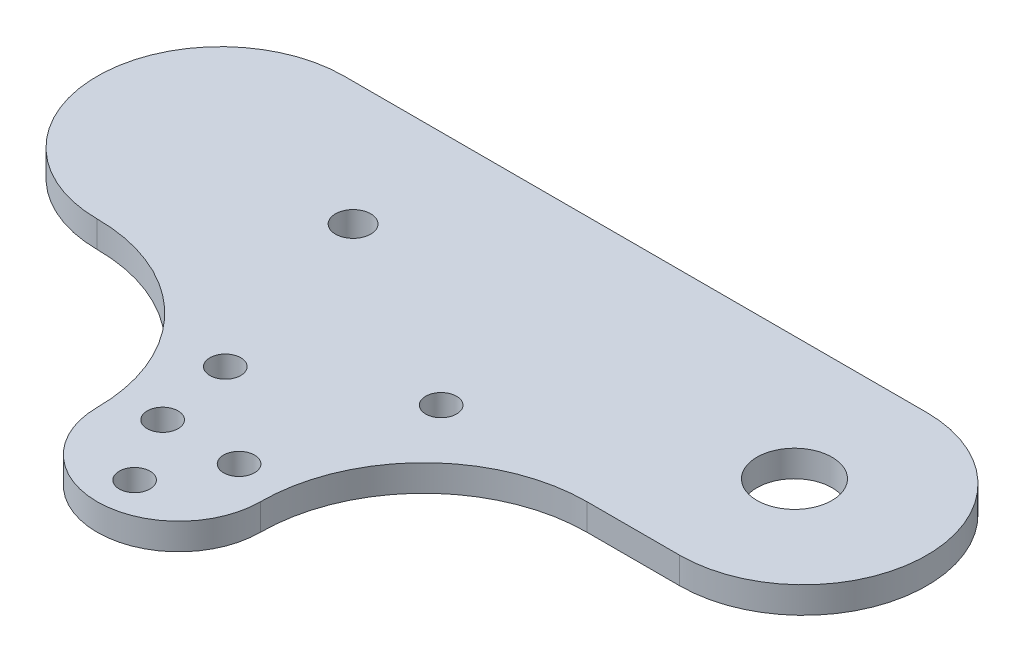
ISO-10303-21;
HEADER;
FILE_DESCRIPTION(('STEP AP214'),'2;1');
FILE_NAME('part.step','',(''),(''),'','','');
FILE_SCHEMA(('AUTOMOTIVE_DESIGN { 1 0 10303 214 1 1 1 1 }'));
ENDSEC;
DATA;
#1=APPLICATION_CONTEXT('core data for automotive mechanical design processes');
#2=APPLICATION_PROTOCOL_DEFINITION('international standard','automotive_design',2000,#1);
#3=PRODUCT_CONTEXT('',#1,'mechanical');
#4=PRODUCT('Part','Part','',(#3));
#5=PRODUCT_RELATED_PRODUCT_CATEGORY('part','',(#4));
#6=PRODUCT_DEFINITION_FORMATION('','',#4);
#7=PRODUCT_DEFINITION_CONTEXT('part definition',#1,'design');
#8=PRODUCT_DEFINITION('design','',#6,#7);
#9=PRODUCT_DEFINITION_SHAPE('','',#8);
#10=(LENGTH_UNIT() NAMED_UNIT(*) SI_UNIT(.MILLI.,.METRE.));
#11=(NAMED_UNIT(*) PLANE_ANGLE_UNIT() SI_UNIT($,.RADIAN.));
#12=(NAMED_UNIT(*) SI_UNIT($,.STERADIAN.) SOLID_ANGLE_UNIT());
#13=UNCERTAINTY_MEASURE_WITH_UNIT(LENGTH_MEASURE(1.E-05),#10,'distance_accuracy_value','');
#14=(GEOMETRIC_REPRESENTATION_CONTEXT(3) GLOBAL_UNCERTAINTY_ASSIGNED_CONTEXT((#13)) GLOBAL_UNIT_ASSIGNED_CONTEXT((#10,
#11,#12)) REPRESENTATION_CONTEXT('',''));
#15=CARTESIAN_POINT('',(0.,0.,0.));
#16=DIRECTION('',(0.,0.,1.));
#17=DIRECTION('',(1.,0.,0.));
#18=AXIS2_PLACEMENT_3D('',#15,#16,#17);
#19=CARTESIAN_POINT('',(26.,3.,0.));
#20=DIRECTION('',(0.,-1.,0.));
#21=DIRECTION('',(0.,0.,-1.));
#22=AXIS2_PLACEMENT_3D('',#19,#20,#21);
#23=CYLINDRICAL_SURFACE('',#22,14.);
#24=DIRECTION('',(0.,-1.,0.));
#25=VECTOR('',#24,1.);
#26=CARTESIAN_POINT('',(26.,3.,-14.));
#27=LINE('',#26,#25);
#28=CARTESIAN_POINT('',(26.,3.,-14.));
#29=VERTEX_POINT('',#28);
#30=CARTESIAN_POINT('',(26.,0.,-14.));
#31=VERTEX_POINT('',#30);
#32=EDGE_CURVE('E151',#29,#31,#27,.T.);
#33=ORIENTED_EDGE('',*,*,#32,.F.);
#34=CARTESIAN_POINT('',(26.,3.,0.));
#35=DIRECTION('',(0.,1.,0.));
#36=DIRECTION('',(0.,0.,1.));
#37=AXIS2_PLACEMENT_3D('',#34,#35,#36);
#38=CIRCLE('',#37,14.);
#39=CARTESIAN_POINT('',(26.,3.,14.));
#40=VERTEX_POINT('',#39);
#41=EDGE_CURVE('E157',#40,#29,#38,.T.);
#42=ORIENTED_EDGE('',*,*,#41,.F.);
#43=DIRECTION('',(0.,-1.,0.));
#44=VECTOR('',#43,1.);
#45=CARTESIAN_POINT('',(26.,3.,14.));
#46=LINE('',#45,#44);
#47=CARTESIAN_POINT('',(26.,0.,14.));
#48=VERTEX_POINT('',#47);
#49=EDGE_CURVE('E154',#48,#40,#46,.F.);
#50=ORIENTED_EDGE('',*,*,#49,.F.);
#51=CARTESIAN_POINT('',(26.,0.,0.));
#52=DIRECTION('',(0.,1.,0.));
#53=DIRECTION('',(0.,0.,1.));
#54=AXIS2_PLACEMENT_3D('',#51,#52,#53);
#55=CIRCLE('',#54,14.);
#56=EDGE_CURVE('E159',#31,#48,#55,.F.);
#57=ORIENTED_EDGE('',*,*,#56,.F.);
#58=EDGE_LOOP('',(#33,#42,#50,#57));
#59=FACE_BOUND('',#58,.T.);
#60=ADVANCED_FACE('F33',(#59),#23,.T.);
#61=CARTESIAN_POINT('',(0.,3.,0.));
#62=DIRECTION('',(0.,1.,0.));
#63=DIRECTION('',(0.,0.,1.));
#64=AXIS2_PLACEMENT_3D('',#61,#62,#63);
#65=PLANE('',#64);
#66=CARTESIAN_POINT('',(-2.24035053756942,3.,12.7860314998515));
#67=DIRECTION('',(0.,1.,0.));
#68=DIRECTION('',(0.,0.,1.));
#69=AXIS2_PLACEMENT_3D('',#66,#67,#68);
#70=CIRCLE('',#69,1.75);
#71=CARTESIAN_POINT('',(-2.24035053756942,3.,11.0360314998515));
#72=VERTEX_POINT('',#71);
#73=EDGE_CURVE('E334',#72,#72,#70,.F.);
#74=ORIENTED_EDGE('',*,*,#73,.T.);
#75=EDGE_LOOP('',(#74));
#76=FACE_BOUND('',#75,.T.);
#77=CARTESIAN_POINT('',(-16.5801270189222,3.,30.));
#78=DIRECTION('',(0.,1.,0.));
#79=DIRECTION('',(0.,0.,1.));
#80=AXIS2_PLACEMENT_3D('',#77,#78,#79);
#81=CIRCLE('',#80,1.75);
#82=CARTESIAN_POINT('',(-16.5801270189222,3.,28.25));
#83=VERTEX_POINT('',#82);
#84=EDGE_CURVE('E338',#83,#83,#81,.F.);
#85=ORIENTED_EDGE('',*,*,#84,.T.);
#86=EDGE_LOOP('',(#85));
#87=FACE_BOUND('',#86,.T.);
#88=CARTESIAN_POINT('',(-7.91987298107778,3.,30.));
#89=DIRECTION('',(0.,1.,0.));
#90=DIRECTION('',(0.,0.,1.));
#91=AXIS2_PLACEMENT_3D('',#88,#89,#90);
#92=CIRCLE('',#91,1.75000000000001);
#93=CARTESIAN_POINT('',(-7.91987298107778,3.,28.25));
#94=VERTEX_POINT('',#93);
#95=EDGE_CURVE('E346',#94,#94,#92,.F.);
#96=ORIENTED_EDGE('',*,*,#95,.T.);
#97=EDGE_LOOP('',(#96));
#98=FACE_BOUND('',#97,.T.);
#99=CARTESIAN_POINT('',(-18.2440780934357,3.,21.2336846309239));
#100=DIRECTION('',(0.,1.,0.));
#101=DIRECTION('',(0.,0.,1.));
#102=AXIS2_PLACEMENT_3D('',#99,#100,#101);
#103=CIRCLE('',#102,1.75);
#104=CARTESIAN_POINT('',(-18.2440780934357,3.,19.4836846309239));
#105=VERTEX_POINT('',#104);
#106=EDGE_CURVE('E351',#105,#105,#103,.F.);
#107=ORIENTED_EDGE('',*,*,#106,.T.);
#108=EDGE_LOOP('',(#107));
#109=FACE_BOUND('',#108,.T.);
#110=CARTESIAN_POINT('',(-12.25,3.,37.5));
#111=DIRECTION('',(0.,1.,0.));
#112=DIRECTION('',(0.,0.,1.));
#113=AXIS2_PLACEMENT_3D('',#110,#111,#112);
#114=CIRCLE('',#113,1.75);
#115=CARTESIAN_POINT('',(-12.25,3.,35.75));
#116=VERTEX_POINT('',#115);
#117=EDGE_CURVE('E118',#116,#116,#114,.F.);
#118=ORIENTED_EDGE('',*,*,#117,.T.);
#119=EDGE_LOOP('',(#118));
#120=FACE_BOUND('',#119,.T.);
#121=CARTESIAN_POINT('',(25.,3.,0.));
#122=DIRECTION('',(0.,1.,0.));
#123=DIRECTION('',(0.,0.,1.));
#124=AXIS2_PLACEMENT_3D('',#121,#122,#123);
#125=CIRCLE('',#124,4.25000000000001);
#126=CARTESIAN_POINT('',(25.,3.,4.25000000000001));
#127=VERTEX_POINT('',#126);
#128=EDGE_CURVE('E133',#127,#127,#125,.T.);
#129=ORIENTED_EDGE('',*,*,#128,.F.);
#130=EDGE_LOOP('',(#129));
#131=FACE_BOUND('',#130,.T.);
#132=CARTESIAN_POINT('',(-40.,3.,0.));
#133=DIRECTION('',(0.,-1.,0.));
#134=DIRECTION('',(0.,0.,-1.));
#135=AXIS2_PLACEMENT_3D('',#132,#133,#134);
#136=CIRCLE('',#135,14.);
#137=CARTESIAN_POINT('',(-40.,3.,14.));
#138=VERTEX_POINT('',#137);
#139=CARTESIAN_POINT('',(-40.,3.,-14.));
#140=VERTEX_POINT('',#139);
#141=EDGE_CURVE('E123',#138,#140,#136,.T.);
#142=ORIENTED_EDGE('',*,*,#141,.F.);
#143=CARTESIAN_POINT('',(-40.,3.,32.5));
#144=DIRECTION('',(0.,1.,0.));
#145=DIRECTION('',(0.,0.,1.));
#146=AXIS2_PLACEMENT_3D('',#143,#144,#145);
#147=CIRCLE('',#146,18.5);
#148=CARTESIAN_POINT('',(-21.5,3.,32.5));
#149=VERTEX_POINT('',#148);
#150=EDGE_CURVE('E11',#138,#149,#147,.F.);
#151=ORIENTED_EDGE('',*,*,#150,.T.);
#152=CARTESIAN_POINT('',(-12.25,3.,32.5));
#153=DIRECTION('',(0.,-1.,0.));
#154=DIRECTION('',(0.,0.,-1.));
#155=AXIS2_PLACEMENT_3D('',#152,#153,#154);
#156=CIRCLE('',#155,9.25);
#157=CARTESIAN_POINT('',(-2.99999999999999,3.,32.5));
#158=VERTEX_POINT('',#157);
#159=EDGE_CURVE('E106',#158,#149,#156,.T.);
#160=ORIENTED_EDGE('',*,*,#159,.F.);
#161=CARTESIAN_POINT('',(15.5,3.,32.5));
#162=DIRECTION('',(0.,1.,0.));
#163=DIRECTION('',(0.,0.,1.));
#164=AXIS2_PLACEMENT_3D('',#161,#162,#163);
#165=CIRCLE('',#164,18.5);
#166=CARTESIAN_POINT('',(15.5,3.,14.));
#167=VERTEX_POINT('',#166);
#168=EDGE_CURVE('E56',#158,#167,#165,.F.);
#169=ORIENTED_EDGE('',*,*,#168,.T.);
#170=DIRECTION('',(1.,0.,0.));
#171=VECTOR('',#170,1.);
#172=CARTESIAN_POINT('',(-40.,3.,14.));
#173=LINE('',#172,#171);
#174=EDGE_CURVE('E142',#167,#40,#173,.T.);
#175=ORIENTED_EDGE('',*,*,#174,.T.);
#176=ORIENTED_EDGE('',*,*,#41,.T.);
#177=DIRECTION('',(-1.,0.,0.));
#178=VECTOR('',#177,1.);
#179=CARTESIAN_POINT('',(-40.,3.,-14.));
#180=LINE('',#179,#178);
#181=EDGE_CURVE('E139',#29,#140,#180,.T.);
#182=ORIENTED_EDGE('',*,*,#181,.T.);
#183=EDGE_LOOP('',(#142,#151,#160,#169,#175,#176,#182));
#184=FACE_BOUND('',#183,.T.);
#185=CARTESIAN_POINT('',(-25.,3.,0.));
#186=DIRECTION('',(0.,1.,0.));
#187=DIRECTION('',(0.,0.,1.));
#188=AXIS2_PLACEMENT_3D('',#185,#186,#187);
#189=CIRCLE('',#188,2.);
#190=CARTESIAN_POINT('',(-25.,3.,2.));
#191=VERTEX_POINT('',#190);
#192=EDGE_CURVE('E127',#191,#191,#189,.T.);
#193=ORIENTED_EDGE('',*,*,#192,.F.);
#194=EDGE_LOOP('',(#193));
#195=FACE_BOUND('',#194,.T.);
#196=ADVANCED_FACE('F173',(#76,#87,#98,#109,#120,#131,#184,#195),#65,.T.);
#197=CARTESIAN_POINT('',(0.,0.,0.));
#198=DIRECTION('',(0.,1.,0.));
#199=DIRECTION('',(0.,0.,1.));
#200=AXIS2_PLACEMENT_3D('',#197,#198,#199);
#201=PLANE('',#200);
#202=CARTESIAN_POINT('',(-2.24035053756942,0.,12.7860314998515));
#203=DIRECTION('',(0.,-1.,0.));
#204=DIRECTION('',(0.,0.,-1.));
#205=AXIS2_PLACEMENT_3D('',#202,#203,#204);
#206=CIRCLE('',#205,1.75);
#207=CARTESIAN_POINT('',(-2.24035053756942,0.,11.0360314998515));
#208=VERTEX_POINT('',#207);
#209=EDGE_CURVE('E337',#208,#208,#206,.T.);
#210=ORIENTED_EDGE('',*,*,#209,.F.);
#211=EDGE_LOOP('',(#210));
#212=FACE_BOUND('',#211,.T.);
#213=CARTESIAN_POINT('',(-16.5801270189222,0.,30.));
#214=DIRECTION('',(0.,-1.,0.));
#215=DIRECTION('',(0.,0.,-1.));
#216=AXIS2_PLACEMENT_3D('',#213,#214,#215);
#217=CIRCLE('',#216,1.75);
#218=CARTESIAN_POINT('',(-16.5801270189222,0.,28.25));
#219=VERTEX_POINT('',#218);
#220=EDGE_CURVE('E341',#219,#219,#217,.T.);
#221=ORIENTED_EDGE('',*,*,#220,.F.);
#222=EDGE_LOOP('',(#221));
#223=FACE_BOUND('',#222,.T.);
#224=CARTESIAN_POINT('',(-7.91987298107778,0.,30.));
#225=DIRECTION('',(0.,-1.,0.));
#226=DIRECTION('',(0.,0.,-1.));
#227=AXIS2_PLACEMENT_3D('',#224,#225,#226);
#228=CIRCLE('',#227,1.75000000000001);
#229=CARTESIAN_POINT('',(-7.91987298107778,0.,28.25));
#230=VERTEX_POINT('',#229);
#231=EDGE_CURVE('E348',#230,#230,#228,.T.);
#232=ORIENTED_EDGE('',*,*,#231,.F.);
#233=EDGE_LOOP('',(#232));
#234=FACE_BOUND('',#233,.T.);
#235=CARTESIAN_POINT('',(-18.2440780934357,0.,21.2336846309239));
#236=DIRECTION('',(0.,-1.,0.));
#237=DIRECTION('',(0.,0.,-1.));
#238=AXIS2_PLACEMENT_3D('',#235,#236,#237);
#239=CIRCLE('',#238,1.75);
#240=CARTESIAN_POINT('',(-18.2440780934357,0.,19.4836846309239));
#241=VERTEX_POINT('',#240);
#242=EDGE_CURVE('E354',#241,#241,#239,.T.);
#243=ORIENTED_EDGE('',*,*,#242,.F.);
#244=EDGE_LOOP('',(#243));
#245=FACE_BOUND('',#244,.T.);
#246=CARTESIAN_POINT('',(-12.25,0.,37.5));
#247=DIRECTION('',(0.,-1.,0.));
#248=DIRECTION('',(0.,0.,-1.));
#249=AXIS2_PLACEMENT_3D('',#246,#247,#248);
#250=CIRCLE('',#249,1.75);
#251=CARTESIAN_POINT('',(-12.25,0.,35.75));
#252=VERTEX_POINT('',#251);
#253=EDGE_CURVE('E114',#252,#252,#250,.T.);
#254=ORIENTED_EDGE('',*,*,#253,.F.);
#255=EDGE_LOOP('',(#254));
#256=FACE_BOUND('',#255,.T.);
#257=CARTESIAN_POINT('',(25.,0.,0.));
#258=DIRECTION('',(0.,1.,0.));
#259=DIRECTION('',(0.,0.,1.));
#260=AXIS2_PLACEMENT_3D('',#257,#258,#259);
#261=CIRCLE('',#260,4.25000000000001);
#262=CARTESIAN_POINT('',(25.,0.,4.25000000000001));
#263=VERTEX_POINT('',#262);
#264=EDGE_CURVE('E130',#263,#263,#261,.T.);
#265=ORIENTED_EDGE('',*,*,#264,.T.);
#266=EDGE_LOOP('',(#265));
#267=FACE_BOUND('',#266,.T.);
#268=DIRECTION('',(-1.,0.,0.));
#269=VECTOR('',#268,1.);
#270=CARTESIAN_POINT('',(-40.,0.,-14.));
#271=LINE('',#270,#269);
#272=CARTESIAN_POINT('',(-40.,0.,-14.));
#273=VERTEX_POINT('',#272);
#274=EDGE_CURVE('E136',#31,#273,#271,.T.);
#275=ORIENTED_EDGE('',*,*,#274,.F.);
#276=ORIENTED_EDGE('',*,*,#56,.T.);
#277=DIRECTION('',(1.,0.,0.));
#278=VECTOR('',#277,1.);
#279=CARTESIAN_POINT('',(-40.,0.,14.));
#280=LINE('',#279,#278);
#281=CARTESIAN_POINT('',(15.5,0.,14.));
#282=VERTEX_POINT('',#281);
#283=EDGE_CURVE('E143',#282,#48,#280,.T.);
#284=ORIENTED_EDGE('',*,*,#283,.F.);
#285=CARTESIAN_POINT('',(15.5,0.,32.5));
#286=DIRECTION('',(0.,1.,0.));
#287=DIRECTION('',(0.,0.,1.));
#288=AXIS2_PLACEMENT_3D('',#285,#286,#287);
#289=CIRCLE('',#288,18.5);
#290=CARTESIAN_POINT('',(-2.99999999999999,0.,32.5));
#291=VERTEX_POINT('',#290);
#292=EDGE_CURVE('E48',#282,#291,#289,.T.);
#293=ORIENTED_EDGE('',*,*,#292,.T.);
#294=CARTESIAN_POINT('',(-12.25,0.,32.5));
#295=DIRECTION('',(0.,-1.,0.));
#296=DIRECTION('',(0.,0.,-1.));
#297=AXIS2_PLACEMENT_3D('',#294,#295,#296);
#298=CIRCLE('',#297,9.25);
#299=CARTESIAN_POINT('',(-21.5,0.,32.5));
#300=VERTEX_POINT('',#299);
#301=EDGE_CURVE('E105',#291,#300,#298,.T.);
#302=ORIENTED_EDGE('',*,*,#301,.T.);
#303=CARTESIAN_POINT('',(-40.,0.,32.5));
#304=DIRECTION('',(0.,1.,0.));
#305=DIRECTION('',(0.,0.,1.));
#306=AXIS2_PLACEMENT_3D('',#303,#304,#305);
#307=CIRCLE('',#306,18.5);
#308=CARTESIAN_POINT('',(-40.,0.,14.));
#309=VERTEX_POINT('',#308);
#310=EDGE_CURVE('E41',#300,#309,#307,.T.);
#311=ORIENTED_EDGE('',*,*,#310,.T.);
#312=CARTESIAN_POINT('',(-40.,0.,0.));
#313=DIRECTION('',(0.,-1.,0.));
#314=DIRECTION('',(0.,0.,-1.));
#315=AXIS2_PLACEMENT_3D('',#312,#313,#314);
#316=CIRCLE('',#315,14.);
#317=EDGE_CURVE('E107',#309,#273,#316,.T.);
#318=ORIENTED_EDGE('',*,*,#317,.T.);
#319=EDGE_LOOP('',(#275,#276,#284,#293,#302,#311,#318));
#320=FACE_BOUND('',#319,.T.);
#321=CARTESIAN_POINT('',(-25.,0.,0.));
#322=DIRECTION('',(0.,1.,0.));
#323=DIRECTION('',(0.,0.,1.));
#324=AXIS2_PLACEMENT_3D('',#321,#322,#323);
#325=CIRCLE('',#324,2.);
#326=CARTESIAN_POINT('',(-25.,0.,2.));
#327=VERTEX_POINT('',#326);
#328=EDGE_CURVE('E125',#327,#327,#325,.T.);
#329=ORIENTED_EDGE('',*,*,#328,.T.);
#330=EDGE_LOOP('',(#329));
#331=FACE_BOUND('',#330,.T.);
#332=ADVANCED_FACE('F111',(#212,#223,#234,#245,#256,#267,#320,#331),#201,.F.);
#333=CARTESIAN_POINT('',(-40.,3.,-14.));
#334=DIRECTION('',(0.,0.,1.));
#335=DIRECTION('',(1.,0.,0.));
#336=AXIS2_PLACEMENT_3D('',#333,#334,#335);
#337=PLANE('',#336);
#338=ORIENTED_EDGE('',*,*,#181,.F.);
#339=ORIENTED_EDGE('',*,*,#32,.T.);
#340=ORIENTED_EDGE('',*,*,#274,.T.);
#341=DIRECTION('',(0.,-1.,0.));
#342=VECTOR('',#341,1.);
#343=CARTESIAN_POINT('',(-40.,3.,-14.));
#344=LINE('',#343,#342);
#345=EDGE_CURVE('E149',#140,#273,#344,.T.);
#346=ORIENTED_EDGE('',*,*,#345,.F.);
#347=EDGE_LOOP('',(#338,#339,#340,#346));
#348=FACE_BOUND('',#347,.T.);
#349=ADVANCED_FACE('F177',(#348),#337,.F.);
#350=CARTESIAN_POINT('',(-40.,3.,14.));
#351=DIRECTION('',(0.,0.,-1.));
#352=DIRECTION('',(-1.,0.,0.));
#353=AXIS2_PLACEMENT_3D('',#350,#351,#352);
#354=PLANE('',#353);
#355=ORIENTED_EDGE('',*,*,#174,.F.);
#356=DIRECTION('',(0.,-1.,0.));
#357=VECTOR('',#356,1.);
#358=CARTESIAN_POINT('',(15.5,3.,14.));
#359=LINE('',#358,#357);
#360=EDGE_CURVE('E162',#167,#282,#359,.T.);
#361=ORIENTED_EDGE('',*,*,#360,.T.);
#362=ORIENTED_EDGE('',*,*,#283,.T.);
#363=ORIENTED_EDGE('',*,*,#49,.T.);
#364=EDGE_LOOP('',(#355,#361,#362,#363));
#365=FACE_BOUND('',#364,.T.);
#366=ADVANCED_FACE('F166',(#365),#354,.F.);
#367=CARTESIAN_POINT('',(25.,3.,0.));
#368=DIRECTION('',(0.,-1.,0.));
#369=DIRECTION('',(0.,0.,-1.));
#370=AXIS2_PLACEMENT_3D('',#367,#368,#369);
#371=CYLINDRICAL_SURFACE('',#370,4.25000000000001);
#372=ORIENTED_EDGE('',*,*,#128,.T.);
#373=EDGE_LOOP('',(#372));
#374=FACE_BOUND('',#373,.T.);
#375=ORIENTED_EDGE('',*,*,#264,.F.);
#376=EDGE_LOOP('',(#375));
#377=FACE_BOUND('',#376,.T.);
#378=ADVANCED_FACE('F188',(#374,#377),#371,.F.);
#379=CARTESIAN_POINT('',(-25.,3.,0.));
#380=DIRECTION('',(0.,-1.,0.));
#381=DIRECTION('',(0.,0.,-1.));
#382=AXIS2_PLACEMENT_3D('',#379,#380,#381);
#383=CYLINDRICAL_SURFACE('',#382,2.);
#384=ORIENTED_EDGE('',*,*,#192,.T.);
#385=EDGE_LOOP('',(#384));
#386=FACE_BOUND('',#385,.T.);
#387=ORIENTED_EDGE('',*,*,#328,.F.);
#388=EDGE_LOOP('',(#387));
#389=FACE_BOUND('',#388,.T.);
#390=ADVANCED_FACE('F182',(#386,#389),#383,.F.);
#391=CARTESIAN_POINT('',(-40.,3.,0.));
#392=DIRECTION('',(0.,-1.,0.));
#393=DIRECTION('',(0.,0.,-1.));
#394=AXIS2_PLACEMENT_3D('',#391,#392,#393);
#395=CYLINDRICAL_SURFACE('',#394,14.);
#396=ORIENTED_EDGE('',*,*,#317,.F.);
#397=DIRECTION('',(0.,-1.,0.));
#398=VECTOR('',#397,1.);
#399=CARTESIAN_POINT('',(-40.,3.,14.));
#400=LINE('',#399,#398);
#401=EDGE_CURVE('E96',#138,#309,#400,.T.);
#402=ORIENTED_EDGE('',*,*,#401,.F.);
#403=ORIENTED_EDGE('',*,*,#141,.T.);
#404=ORIENTED_EDGE('',*,*,#345,.T.);
#405=EDGE_LOOP('',(#396,#402,#403,#404));
#406=FACE_BOUND('',#405,.T.);
#407=ADVANCED_FACE('F179',(#406),#395,.T.);
#408=CARTESIAN_POINT('',(15.5,3.,32.5));
#409=DIRECTION('',(0.,-1.,0.));
#410=DIRECTION('',(0.,0.,-1.));
#411=AXIS2_PLACEMENT_3D('',#408,#409,#410);
#412=CYLINDRICAL_SURFACE('',#411,18.5);
#413=ORIENTED_EDGE('',*,*,#168,.F.);
#414=DIRECTION('',(0.,-1.,0.));
#415=VECTOR('',#414,1.);
#416=CARTESIAN_POINT('',(-2.99999999999999,3.,32.5));
#417=LINE('',#416,#415);
#418=EDGE_CURVE('E108',#158,#291,#417,.T.);
#419=ORIENTED_EDGE('',*,*,#418,.T.);
#420=ORIENTED_EDGE('',*,*,#292,.F.);
#421=ORIENTED_EDGE('',*,*,#360,.F.);
#422=EDGE_LOOP('',(#413,#419,#420,#421));
#423=FACE_BOUND('',#422,.T.);
#424=ADVANCED_FACE('F181',(#423),#412,.F.);
#425=CARTESIAN_POINT('',(-40.,3.,32.5));
#426=DIRECTION('',(0.,-1.,0.));
#427=DIRECTION('',(0.,0.,-1.));
#428=AXIS2_PLACEMENT_3D('',#425,#426,#427);
#429=CYLINDRICAL_SURFACE('',#428,18.5);
#430=ORIENTED_EDGE('',*,*,#150,.F.);
#431=ORIENTED_EDGE('',*,*,#401,.T.);
#432=ORIENTED_EDGE('',*,*,#310,.F.);
#433=DIRECTION('',(0.,-1.,0.));
#434=VECTOR('',#433,1.);
#435=CARTESIAN_POINT('',(-21.5,3.,32.5));
#436=LINE('',#435,#434);
#437=EDGE_CURVE('E94',#149,#300,#436,.T.);
#438=ORIENTED_EDGE('',*,*,#437,.F.);
#439=EDGE_LOOP('',(#430,#431,#432,#438));
#440=FACE_BOUND('',#439,.T.);
#441=ADVANCED_FACE('F35',(#440),#429,.F.);
#442=CARTESIAN_POINT('',(-12.25,3.,32.5));
#443=DIRECTION('',(0.,-1.,0.));
#444=DIRECTION('',(0.,0.,-1.));
#445=AXIS2_PLACEMENT_3D('',#442,#443,#444);
#446=CYLINDRICAL_SURFACE('',#445,9.25);
#447=ORIENTED_EDGE('',*,*,#301,.F.);
#448=ORIENTED_EDGE('',*,*,#418,.F.);
#449=ORIENTED_EDGE('',*,*,#159,.T.);
#450=ORIENTED_EDGE('',*,*,#437,.T.);
#451=EDGE_LOOP('',(#447,#448,#449,#450));
#452=FACE_BOUND('',#451,.T.);
#453=ADVANCED_FACE('F103',(#452),#446,.T.);
#454=CARTESIAN_POINT('',(-12.25,3.001,37.5));
#455=DIRECTION('',(0.,-1.,0.));
#456=DIRECTION('',(0.,0.,-1.));
#457=AXIS2_PLACEMENT_3D('',#454,#455,#456);
#458=CYLINDRICAL_SURFACE('',#457,1.75);
#459=CARTESIAN_POINT('',(-12.25,3.,35.75));
#460=CARTESIAN_POINT('',(-12.25,2.96875,35.75));
#461=CARTESIAN_POINT('',(-12.25,2.9375,35.75));
#462=CARTESIAN_POINT('',(-12.25,2.875,35.75));
#463=CARTESIAN_POINT('',(-12.25,2.84375,35.75));
#464=CARTESIAN_POINT('',(-12.25,2.78125,35.75));
#465=CARTESIAN_POINT('',(-12.25,2.75,35.75));
#466=CARTESIAN_POINT('',(-12.25,2.6875,35.75));
#467=CARTESIAN_POINT('',(-12.25,2.65625,35.75));
#468=CARTESIAN_POINT('',(-12.25,2.59375,35.75));
#469=CARTESIAN_POINT('',(-12.25,2.5625,35.75));
#470=CARTESIAN_POINT('',(-12.25,2.5,35.75));
#471=CARTESIAN_POINT('',(-12.25,2.46875,35.75));
#472=CARTESIAN_POINT('',(-12.25,2.40625,35.75));
#473=CARTESIAN_POINT('',(-12.25,2.375,35.75));
#474=CARTESIAN_POINT('',(-12.25,2.3125,35.75));
#475=CARTESIAN_POINT('',(-12.25,2.28125,35.75));
#476=CARTESIAN_POINT('',(-12.25,2.21875,35.75));
#477=CARTESIAN_POINT('',(-12.25,2.1875,35.75));
#478=CARTESIAN_POINT('',(-12.25,2.125,35.75));
#479=CARTESIAN_POINT('',(-12.25,2.09375,35.75));
#480=CARTESIAN_POINT('',(-12.25,2.03125,35.75));
#481=CARTESIAN_POINT('',(-12.25,2.,35.75));
#482=CARTESIAN_POINT('',(-12.25,1.9375,35.75));
#483=CARTESIAN_POINT('',(-12.25,1.90625,35.75));
#484=CARTESIAN_POINT('',(-12.25,1.84375,35.75));
#485=CARTESIAN_POINT('',(-12.25,1.8125,35.75));
#486=CARTESIAN_POINT('',(-12.25,1.75,35.75));
#487=CARTESIAN_POINT('',(-12.25,1.71875,35.75));
#488=CARTESIAN_POINT('',(-12.25,1.65625,35.75));
#489=CARTESIAN_POINT('',(-12.25,1.625,35.75));
#490=CARTESIAN_POINT('',(-12.25,1.5625,35.75));
#491=CARTESIAN_POINT('',(-12.25,1.53125,35.75));
#492=CARTESIAN_POINT('',(-12.25,1.46875,35.75));
#493=CARTESIAN_POINT('',(-12.25,1.4375,35.75));
#494=CARTESIAN_POINT('',(-12.25,1.375,35.75));
#495=CARTESIAN_POINT('',(-12.25,1.34375,35.75));
#496=CARTESIAN_POINT('',(-12.25,1.28125,35.75));
#497=CARTESIAN_POINT('',(-12.25,1.25,35.75));
#498=CARTESIAN_POINT('',(-12.25,1.1875,35.75));
#499=CARTESIAN_POINT('',(-12.25,1.15625,35.75));
#500=CARTESIAN_POINT('',(-12.25,1.09375,35.75));
#501=CARTESIAN_POINT('',(-12.25,1.0625,35.75));
#502=CARTESIAN_POINT('',(-12.25,1.,35.75));
#503=CARTESIAN_POINT('',(-12.25,0.96875,35.75));
#504=CARTESIAN_POINT('',(-12.25,0.90625,35.75));
#505=CARTESIAN_POINT('',(-12.25,0.875,35.75));
#506=CARTESIAN_POINT('',(-12.25,0.8125,35.75));
#507=CARTESIAN_POINT('',(-12.25,0.78125,35.75));
#508=CARTESIAN_POINT('',(-12.25,0.71875,35.75));
#509=CARTESIAN_POINT('',(-12.25,0.6875,35.75));
#510=CARTESIAN_POINT('',(-12.25,0.625,35.75));
#511=CARTESIAN_POINT('',(-12.25,0.59375,35.75));
#512=CARTESIAN_POINT('',(-12.25,0.53125,35.75));
#513=CARTESIAN_POINT('',(-12.25,0.5,35.75));
#514=CARTESIAN_POINT('',(-12.25,0.4375,35.75));
#515=CARTESIAN_POINT('',(-12.25,0.40625,35.75));
#516=CARTESIAN_POINT('',(-12.25,0.34375,35.75));
#517=CARTESIAN_POINT('',(-12.25,0.3125,35.75));
#518=CARTESIAN_POINT('',(-12.25,0.25,35.75));
#519=CARTESIAN_POINT('',(-12.25,0.21875,35.75));
#520=CARTESIAN_POINT('',(-12.25,0.156250000000001,35.75));
#521=CARTESIAN_POINT('',(-12.25,0.125000000000001,35.75));
#522=CARTESIAN_POINT('',(-12.25,0.0625000000000005,35.75));
#523=CARTESIAN_POINT('',(-12.25,0.0312500000000005,35.75));
#524=CARTESIAN_POINT('',(-12.25,0.,35.75));
#525=B_SPLINE_CURVE_WITH_KNOTS('',3,(#459,#460,#461,#462,#463,#464,#465,#466,#467,#468,#469,
#470,#471,#472,#473,#474,#475,#476,#477,#478,#479,#480,#481,#482,#483,#484,#485,#486,#487,#488,
#489,#490,#491,#492,#493,#494,#495,#496,#497,#498,#499,#500,#501,#502,#503,#504,#505,#506,#507,
#508,#509,#510,#511,#512,#513,#514,#515,#516,#517,#518,#519,#520,#521,#522,#523,#524),
.UNSPECIFIED.,.F.,.F.,(4,2,2,2,2,2,2,2,2,2,2,2,2,2,2,2,2,2,2,2,2,2,2,2,2,2,2,2,2,2,2,2,4),(0.,
0.0937499999999997,0.1875,0.28125,0.375,0.46875,0.5625,0.65625,0.749999999999999,
0.843749999999999,0.9375,1.03125,1.125,1.21875,1.3125,1.40625,1.5,1.59375,1.6875,1.78125,1.875,
1.96875,2.0625,2.15625,2.25,2.34375,2.4375,2.53125,2.625,2.71875,2.8125,2.90625,3.),.UNSPECIFIED.);
#526=EDGE_CURVE('BSEAM268',#116,#252,#525,.T.);
#527=ORIENTED_EDGE('',*,*,#117,.F.);
#528=ORIENTED_EDGE('',*,*,#253,.T.);
#529=ORIENTED_EDGE('',*,*,#526,.T.);
#530=ORIENTED_EDGE('',*,*,#526,.F.);
#531=EDGE_LOOP('',(#527,#529,#528,#530));
#532=FACE_BOUND('',#531,.T.);
#533=ADVANCED_FACE('F268',(#532),#458,.F.);
#534=CARTESIAN_POINT('',(-18.2440780934357,3.001,21.2336846309239));
#535=DIRECTION('',(0.,-1.,0.));
#536=DIRECTION('',(0.,0.,-1.));
#537=AXIS2_PLACEMENT_3D('',#534,#535,#536);
#538=CYLINDRICAL_SURFACE('',#537,1.75);
#539=CARTESIAN_POINT('',(-18.2440780934357,3.,19.4836846309239));
#540=CARTESIAN_POINT('',(-18.2440780934357,2.96875,19.4836846309239));
#541=CARTESIAN_POINT('',(-18.2440780934357,2.9375,19.4836846309239));
#542=CARTESIAN_POINT('',(-18.2440780934357,2.875,19.4836846309239));
#543=CARTESIAN_POINT('',(-18.2440780934357,2.84375,19.4836846309239));
#544=CARTESIAN_POINT('',(-18.2440780934357,2.78125,19.4836846309239));
#545=CARTESIAN_POINT('',(-18.2440780934357,2.75,19.4836846309239));
#546=CARTESIAN_POINT('',(-18.2440780934357,2.6875,19.4836846309239));
#547=CARTESIAN_POINT('',(-18.2440780934357,2.65625,19.4836846309239));
#548=CARTESIAN_POINT('',(-18.2440780934357,2.59375,19.4836846309239));
#549=CARTESIAN_POINT('',(-18.2440780934357,2.5625,19.4836846309239));
#550=CARTESIAN_POINT('',(-18.2440780934357,2.5,19.4836846309239));
#551=CARTESIAN_POINT('',(-18.2440780934357,2.46875,19.4836846309239));
#552=CARTESIAN_POINT('',(-18.2440780934357,2.40625,19.4836846309239));
#553=CARTESIAN_POINT('',(-18.2440780934357,2.375,19.4836846309239));
#554=CARTESIAN_POINT('',(-18.2440780934357,2.3125,19.4836846309239));
#555=CARTESIAN_POINT('',(-18.2440780934357,2.28125,19.4836846309239));
#556=CARTESIAN_POINT('',(-18.2440780934357,2.21875,19.4836846309239));
#557=CARTESIAN_POINT('',(-18.2440780934357,2.1875,19.4836846309239));
#558=CARTESIAN_POINT('',(-18.2440780934357,2.125,19.4836846309239));
#559=CARTESIAN_POINT('',(-18.2440780934357,2.09375,19.4836846309239));
#560=CARTESIAN_POINT('',(-18.2440780934357,2.03125,19.4836846309239));
#561=CARTESIAN_POINT('',(-18.2440780934357,2.,19.4836846309239));
#562=CARTESIAN_POINT('',(-18.2440780934357,1.9375,19.4836846309239));
#563=CARTESIAN_POINT('',(-18.2440780934357,1.90625,19.4836846309239));
#564=CARTESIAN_POINT('',(-18.2440780934357,1.84375,19.4836846309239));
#565=CARTESIAN_POINT('',(-18.2440780934357,1.8125,19.4836846309239));
#566=CARTESIAN_POINT('',(-18.2440780934357,1.75,19.4836846309239));
#567=CARTESIAN_POINT('',(-18.2440780934357,1.71875,19.4836846309239));
#568=CARTESIAN_POINT('',(-18.2440780934357,1.65625,19.4836846309239));
#569=CARTESIAN_POINT('',(-18.2440780934357,1.625,19.4836846309239));
#570=CARTESIAN_POINT('',(-18.2440780934357,1.5625,19.4836846309239));
#571=CARTESIAN_POINT('',(-18.2440780934357,1.53125,19.4836846309239));
#572=CARTESIAN_POINT('',(-18.2440780934357,1.46875,19.4836846309239));
#573=CARTESIAN_POINT('',(-18.2440780934357,1.4375,19.4836846309239));
#574=CARTESIAN_POINT('',(-18.2440780934357,1.375,19.4836846309239));
#575=CARTESIAN_POINT('',(-18.2440780934357,1.34375,19.4836846309239));
#576=CARTESIAN_POINT('',(-18.2440780934357,1.28125,19.4836846309239));
#577=CARTESIAN_POINT('',(-18.2440780934357,1.25,19.4836846309239));
#578=CARTESIAN_POINT('',(-18.2440780934357,1.1875,19.4836846309239));
#579=CARTESIAN_POINT('',(-18.2440780934357,1.15625,19.4836846309239));
#580=CARTESIAN_POINT('',(-18.2440780934357,1.09375,19.4836846309239));
#581=CARTESIAN_POINT('',(-18.2440780934357,1.0625,19.4836846309239));
#582=CARTESIAN_POINT('',(-18.2440780934357,1.,19.4836846309239));
#583=CARTESIAN_POINT('',(-18.2440780934357,0.96875,19.4836846309239));
#584=CARTESIAN_POINT('',(-18.2440780934357,0.90625,19.4836846309239));
#585=CARTESIAN_POINT('',(-18.2440780934357,0.875,19.4836846309239));
#586=CARTESIAN_POINT('',(-18.2440780934357,0.8125,19.4836846309239));
#587=CARTESIAN_POINT('',(-18.2440780934357,0.78125,19.4836846309239));
#588=CARTESIAN_POINT('',(-18.2440780934357,0.71875,19.4836846309239));
#589=CARTESIAN_POINT('',(-18.2440780934357,0.6875,19.4836846309239));
#590=CARTESIAN_POINT('',(-18.2440780934357,0.625,19.4836846309239));
#591=CARTESIAN_POINT('',(-18.2440780934357,0.59375,19.4836846309239));
#592=CARTESIAN_POINT('',(-18.2440780934357,0.53125,19.4836846309239));
#593=CARTESIAN_POINT('',(-18.2440780934357,0.5,19.4836846309239));
#594=CARTESIAN_POINT('',(-18.2440780934357,0.4375,19.4836846309239));
#595=CARTESIAN_POINT('',(-18.2440780934357,0.40625,19.4836846309239));
#596=CARTESIAN_POINT('',(-18.2440780934357,0.34375,19.4836846309239));
#597=CARTESIAN_POINT('',(-18.2440780934357,0.3125,19.4836846309239));
#598=CARTESIAN_POINT('',(-18.2440780934357,0.25,19.4836846309239));
#599=CARTESIAN_POINT('',(-18.2440780934357,0.21875,19.4836846309239));
#600=CARTESIAN_POINT('',(-18.2440780934357,0.156250000000001,19.4836846309239));
#601=CARTESIAN_POINT('',(-18.2440780934357,0.125000000000001,19.4836846309239));
#602=CARTESIAN_POINT('',(-18.2440780934357,0.0625000000000005,19.4836846309239));
#603=CARTESIAN_POINT('',(-18.2440780934357,0.0312500000000005,19.4836846309239));
#604=CARTESIAN_POINT('',(-18.2440780934357,0.,19.4836846309239));
#605=B_SPLINE_CURVE_WITH_KNOTS('',3,(#539,#540,#541,#542,#543,#544,#545,#546,#547,#548,#549,
#550,#551,#552,#553,#554,#555,#556,#557,#558,#559,#560,#561,#562,#563,#564,#565,#566,#567,#568,
#569,#570,#571,#572,#573,#574,#575,#576,#577,#578,#579,#580,#581,#582,#583,#584,#585,#586,#587,
#588,#589,#590,#591,#592,#593,#594,#595,#596,#597,#598,#599,#600,#601,#602,#603,#604),
.UNSPECIFIED.,.F.,.F.,(4,2,2,2,2,2,2,2,2,2,2,2,2,2,2,2,2,2,2,2,2,2,2,2,2,2,2,2,2,2,2,2,4),(0.,
0.0937499999999997,0.1875,0.28125,0.375,0.46875,0.5625,0.65625,0.749999999999999,
0.843749999999999,0.9375,1.03125,1.125,1.21875,1.3125,1.40625,1.5,1.59375,1.6875,1.78125,1.875,
1.96875,2.0625,2.15625,2.25,2.34375,2.4375,2.53125,2.625,2.71875,2.8125,2.90625,3.),.UNSPECIFIED.);
#606=EDGE_CURVE('BSEAM287',#105,#241,#605,.T.);
#607=ORIENTED_EDGE('',*,*,#106,.F.);
#608=ORIENTED_EDGE('',*,*,#242,.T.);
#609=ORIENTED_EDGE('',*,*,#606,.T.);
#610=ORIENTED_EDGE('',*,*,#606,.F.);
#611=EDGE_LOOP('',(#607,#609,#608,#610));
#612=FACE_BOUND('',#611,.T.);
#613=ADVANCED_FACE('F287',(#612),#538,.F.);
#614=CARTESIAN_POINT('',(-7.91987298107778,3.001,30.));
#615=DIRECTION('',(0.,-1.,0.));
#616=DIRECTION('',(0.,0.,-1.));
#617=AXIS2_PLACEMENT_3D('',#614,#615,#616);
#618=CYLINDRICAL_SURFACE('',#617,1.75000000000001);
#619=CARTESIAN_POINT('',(-7.91987298107778,3.,28.25));
#620=CARTESIAN_POINT('',(-7.91987298107778,2.96875,28.25));
#621=CARTESIAN_POINT('',(-7.91987298107778,2.9375,28.25));
#622=CARTESIAN_POINT('',(-7.91987298107778,2.875,28.25));
#623=CARTESIAN_POINT('',(-7.91987298107778,2.84375,28.25));
#624=CARTESIAN_POINT('',(-7.91987298107778,2.78125,28.25));
#625=CARTESIAN_POINT('',(-7.91987298107778,2.75,28.25));
#626=CARTESIAN_POINT('',(-7.91987298107778,2.6875,28.25));
#627=CARTESIAN_POINT('',(-7.91987298107778,2.65625,28.25));
#628=CARTESIAN_POINT('',(-7.91987298107778,2.59375,28.25));
#629=CARTESIAN_POINT('',(-7.91987298107778,2.5625,28.25));
#630=CARTESIAN_POINT('',(-7.91987298107778,2.5,28.25));
#631=CARTESIAN_POINT('',(-7.91987298107778,2.46875,28.25));
#632=CARTESIAN_POINT('',(-7.91987298107778,2.40625,28.25));
#633=CARTESIAN_POINT('',(-7.91987298107778,2.375,28.25));
#634=CARTESIAN_POINT('',(-7.91987298107778,2.3125,28.25));
#635=CARTESIAN_POINT('',(-7.91987298107778,2.28125,28.25));
#636=CARTESIAN_POINT('',(-7.91987298107778,2.21875,28.25));
#637=CARTESIAN_POINT('',(-7.91987298107778,2.1875,28.25));
#638=CARTESIAN_POINT('',(-7.91987298107778,2.125,28.25));
#639=CARTESIAN_POINT('',(-7.91987298107778,2.09375,28.25));
#640=CARTESIAN_POINT('',(-7.91987298107778,2.03125,28.25));
#641=CARTESIAN_POINT('',(-7.91987298107778,2.,28.25));
#642=CARTESIAN_POINT('',(-7.91987298107778,1.9375,28.25));
#643=CARTESIAN_POINT('',(-7.91987298107778,1.90625,28.25));
#644=CARTESIAN_POINT('',(-7.91987298107778,1.84375,28.25));
#645=CARTESIAN_POINT('',(-7.91987298107778,1.8125,28.25));
#646=CARTESIAN_POINT('',(-7.91987298107778,1.75,28.25));
#647=CARTESIAN_POINT('',(-7.91987298107778,1.71875,28.25));
#648=CARTESIAN_POINT('',(-7.91987298107778,1.65625,28.25));
#649=CARTESIAN_POINT('',(-7.91987298107778,1.625,28.25));
#650=CARTESIAN_POINT('',(-7.91987298107778,1.5625,28.25));
#651=CARTESIAN_POINT('',(-7.91987298107778,1.53125,28.25));
#652=CARTESIAN_POINT('',(-7.91987298107778,1.46875,28.25));
#653=CARTESIAN_POINT('',(-7.91987298107778,1.4375,28.25));
#654=CARTESIAN_POINT('',(-7.91987298107778,1.375,28.25));
#655=CARTESIAN_POINT('',(-7.91987298107778,1.34375,28.25));
#656=CARTESIAN_POINT('',(-7.91987298107778,1.28125,28.25));
#657=CARTESIAN_POINT('',(-7.91987298107778,1.25,28.25));
#658=CARTESIAN_POINT('',(-7.91987298107778,1.1875,28.25));
#659=CARTESIAN_POINT('',(-7.91987298107778,1.15625,28.25));
#660=CARTESIAN_POINT('',(-7.91987298107778,1.09375,28.25));
#661=CARTESIAN_POINT('',(-7.91987298107778,1.0625,28.25));
#662=CARTESIAN_POINT('',(-7.91987298107778,1.,28.25));
#663=CARTESIAN_POINT('',(-7.91987298107778,0.96875,28.25));
#664=CARTESIAN_POINT('',(-7.91987298107778,0.90625,28.25));
#665=CARTESIAN_POINT('',(-7.91987298107778,0.875,28.25));
#666=CARTESIAN_POINT('',(-7.91987298107778,0.8125,28.25));
#667=CARTESIAN_POINT('',(-7.91987298107778,0.78125,28.25));
#668=CARTESIAN_POINT('',(-7.91987298107778,0.71875,28.25));
#669=CARTESIAN_POINT('',(-7.91987298107778,0.6875,28.25));
#670=CARTESIAN_POINT('',(-7.91987298107778,0.625,28.25));
#671=CARTESIAN_POINT('',(-7.91987298107778,0.59375,28.25));
#672=CARTESIAN_POINT('',(-7.91987298107778,0.53125,28.25));
#673=CARTESIAN_POINT('',(-7.91987298107778,0.5,28.25));
#674=CARTESIAN_POINT('',(-7.91987298107778,0.4375,28.25));
#675=CARTESIAN_POINT('',(-7.91987298107778,0.40625,28.25));
#676=CARTESIAN_POINT('',(-7.91987298107778,0.34375,28.25));
#677=CARTESIAN_POINT('',(-7.91987298107778,0.3125,28.25));
#678=CARTESIAN_POINT('',(-7.91987298107778,0.25,28.25));
#679=CARTESIAN_POINT('',(-7.91987298107778,0.21875,28.25));
#680=CARTESIAN_POINT('',(-7.91987298107778,0.156250000000001,28.25));
#681=CARTESIAN_POINT('',(-7.91987298107778,0.125000000000001,28.25));
#682=CARTESIAN_POINT('',(-7.91987298107778,0.0625000000000005,28.25));
#683=CARTESIAN_POINT('',(-7.91987298107778,0.0312500000000005,28.25));
#684=CARTESIAN_POINT('',(-7.91987298107778,0.,28.25));
#685=B_SPLINE_CURVE_WITH_KNOTS('',3,(#619,#620,#621,#622,#623,#624,#625,#626,#627,#628,#629,
#630,#631,#632,#633,#634,#635,#636,#637,#638,#639,#640,#641,#642,#643,#644,#645,#646,#647,#648,
#649,#650,#651,#652,#653,#654,#655,#656,#657,#658,#659,#660,#661,#662,#663,#664,#665,#666,#667,
#668,#669,#670,#671,#672,#673,#674,#675,#676,#677,#678,#679,#680,#681,#682,#683,#684),
.UNSPECIFIED.,.F.,.F.,(4,2,2,2,2,2,2,2,2,2,2,2,2,2,2,2,2,2,2,2,2,2,2,2,2,2,2,2,2,2,2,2,4),(0.,
0.0937499999999997,0.1875,0.28125,0.375,0.46875,0.5625,0.65625,0.749999999999999,
0.843749999999999,0.9375,1.03125,1.125,1.21875,1.3125,1.40625,1.5,1.59375,1.6875,1.78125,1.875,
1.96875,2.0625,2.15625,2.25,2.34375,2.4375,2.53125,2.625,2.71875,2.8125,2.90625,3.),.UNSPECIFIED.);
#686=EDGE_CURVE('BSEAM297',#94,#230,#685,.T.);
#687=ORIENTED_EDGE('',*,*,#95,.F.);
#688=ORIENTED_EDGE('',*,*,#231,.T.);
#689=ORIENTED_EDGE('',*,*,#686,.T.);
#690=ORIENTED_EDGE('',*,*,#686,.F.);
#691=EDGE_LOOP('',(#687,#689,#688,#690));
#692=FACE_BOUND('',#691,.T.);
#693=ADVANCED_FACE('F297',(#692),#618,.F.);
#694=CARTESIAN_POINT('',(-16.5801270189222,3.001,30.));
#695=DIRECTION('',(0.,-1.,0.));
#696=DIRECTION('',(0.,0.,-1.));
#697=AXIS2_PLACEMENT_3D('',#694,#695,#696);
#698=CYLINDRICAL_SURFACE('',#697,1.75);
#699=CARTESIAN_POINT('',(-16.5801270189222,3.,28.25));
#700=CARTESIAN_POINT('',(-16.5801270189222,2.96875,28.25));
#701=CARTESIAN_POINT('',(-16.5801270189222,2.9375,28.25));
#702=CARTESIAN_POINT('',(-16.5801270189222,2.875,28.25));
#703=CARTESIAN_POINT('',(-16.5801270189222,2.84375,28.25));
#704=CARTESIAN_POINT('',(-16.5801270189222,2.78125,28.25));
#705=CARTESIAN_POINT('',(-16.5801270189222,2.75,28.25));
#706=CARTESIAN_POINT('',(-16.5801270189222,2.6875,28.25));
#707=CARTESIAN_POINT('',(-16.5801270189222,2.65625,28.25));
#708=CARTESIAN_POINT('',(-16.5801270189222,2.59375,28.25));
#709=CARTESIAN_POINT('',(-16.5801270189222,2.5625,28.25));
#710=CARTESIAN_POINT('',(-16.5801270189222,2.5,28.25));
#711=CARTESIAN_POINT('',(-16.5801270189222,2.46875,28.25));
#712=CARTESIAN_POINT('',(-16.5801270189222,2.40625,28.25));
#713=CARTESIAN_POINT('',(-16.5801270189222,2.375,28.25));
#714=CARTESIAN_POINT('',(-16.5801270189222,2.3125,28.25));
#715=CARTESIAN_POINT('',(-16.5801270189222,2.28125,28.25));
#716=CARTESIAN_POINT('',(-16.5801270189222,2.21875,28.25));
#717=CARTESIAN_POINT('',(-16.5801270189222,2.1875,28.25));
#718=CARTESIAN_POINT('',(-16.5801270189222,2.125,28.25));
#719=CARTESIAN_POINT('',(-16.5801270189222,2.09375,28.25));
#720=CARTESIAN_POINT('',(-16.5801270189222,2.03125,28.25));
#721=CARTESIAN_POINT('',(-16.5801270189222,2.,28.25));
#722=CARTESIAN_POINT('',(-16.5801270189222,1.9375,28.25));
#723=CARTESIAN_POINT('',(-16.5801270189222,1.90625,28.25));
#724=CARTESIAN_POINT('',(-16.5801270189222,1.84375,28.25));
#725=CARTESIAN_POINT('',(-16.5801270189222,1.8125,28.25));
#726=CARTESIAN_POINT('',(-16.5801270189222,1.75,28.25));
#727=CARTESIAN_POINT('',(-16.5801270189222,1.71875,28.25));
#728=CARTESIAN_POINT('',(-16.5801270189222,1.65625,28.25));
#729=CARTESIAN_POINT('',(-16.5801270189222,1.625,28.25));
#730=CARTESIAN_POINT('',(-16.5801270189222,1.5625,28.25));
#731=CARTESIAN_POINT('',(-16.5801270189222,1.53125,28.25));
#732=CARTESIAN_POINT('',(-16.5801270189222,1.46875,28.25));
#733=CARTESIAN_POINT('',(-16.5801270189222,1.4375,28.25));
#734=CARTESIAN_POINT('',(-16.5801270189222,1.375,28.25));
#735=CARTESIAN_POINT('',(-16.5801270189222,1.34375,28.25));
#736=CARTESIAN_POINT('',(-16.5801270189222,1.28125,28.25));
#737=CARTESIAN_POINT('',(-16.5801270189222,1.25,28.25));
#738=CARTESIAN_POINT('',(-16.5801270189222,1.1875,28.25));
#739=CARTESIAN_POINT('',(-16.5801270189222,1.15625,28.25));
#740=CARTESIAN_POINT('',(-16.5801270189222,1.09375,28.25));
#741=CARTESIAN_POINT('',(-16.5801270189222,1.0625,28.25));
#742=CARTESIAN_POINT('',(-16.5801270189222,1.,28.25));
#743=CARTESIAN_POINT('',(-16.5801270189222,0.96875,28.25));
#744=CARTESIAN_POINT('',(-16.5801270189222,0.90625,28.25));
#745=CARTESIAN_POINT('',(-16.5801270189222,0.875,28.25));
#746=CARTESIAN_POINT('',(-16.5801270189222,0.8125,28.25));
#747=CARTESIAN_POINT('',(-16.5801270189222,0.78125,28.25));
#748=CARTESIAN_POINT('',(-16.5801270189222,0.71875,28.25));
#749=CARTESIAN_POINT('',(-16.5801270189222,0.6875,28.25));
#750=CARTESIAN_POINT('',(-16.5801270189222,0.625,28.25));
#751=CARTESIAN_POINT('',(-16.5801270189222,0.59375,28.25));
#752=CARTESIAN_POINT('',(-16.5801270189222,0.53125,28.25));
#753=CARTESIAN_POINT('',(-16.5801270189222,0.5,28.25));
#754=CARTESIAN_POINT('',(-16.5801270189222,0.4375,28.25));
#755=CARTESIAN_POINT('',(-16.5801270189222,0.40625,28.25));
#756=CARTESIAN_POINT('',(-16.5801270189222,0.34375,28.25));
#757=CARTESIAN_POINT('',(-16.5801270189222,0.3125,28.25));
#758=CARTESIAN_POINT('',(-16.5801270189222,0.25,28.25));
#759=CARTESIAN_POINT('',(-16.5801270189222,0.21875,28.25));
#760=CARTESIAN_POINT('',(-16.5801270189222,0.156250000000001,28.25));
#761=CARTESIAN_POINT('',(-16.5801270189222,0.125000000000001,28.25));
#762=CARTESIAN_POINT('',(-16.5801270189222,0.0625000000000005,28.25));
#763=CARTESIAN_POINT('',(-16.5801270189222,0.0312500000000005,28.25));
#764=CARTESIAN_POINT('',(-16.5801270189222,0.,28.25));
#765=B_SPLINE_CURVE_WITH_KNOTS('',3,(#699,#700,#701,#702,#703,#704,#705,#706,#707,#708,#709,
#710,#711,#712,#713,#714,#715,#716,#717,#718,#719,#720,#721,#722,#723,#724,#725,#726,#727,#728,
#729,#730,#731,#732,#733,#734,#735,#736,#737,#738,#739,#740,#741,#742,#743,#744,#745,#746,#747,
#748,#749,#750,#751,#752,#753,#754,#755,#756,#757,#758,#759,#760,#761,#762,#763,#764),
.UNSPECIFIED.,.F.,.F.,(4,2,2,2,2,2,2,2,2,2,2,2,2,2,2,2,2,2,2,2,2,2,2,2,2,2,2,2,2,2,2,2,4),(0.,
0.0937499999999997,0.1875,0.28125,0.375,0.46875,0.5625,0.65625,0.749999999999999,
0.843749999999999,0.9375,1.03125,1.125,1.21875,1.3125,1.40625,1.5,1.59375,1.6875,1.78125,1.875,
1.96875,2.0625,2.15625,2.25,2.34375,2.4375,2.53125,2.625,2.71875,2.8125,2.90625,3.),.UNSPECIFIED.);
#766=EDGE_CURVE('BSEAM307',#83,#219,#765,.T.);
#767=ORIENTED_EDGE('',*,*,#84,.F.);
#768=ORIENTED_EDGE('',*,*,#220,.T.);
#769=ORIENTED_EDGE('',*,*,#766,.T.);
#770=ORIENTED_EDGE('',*,*,#766,.F.);
#771=EDGE_LOOP('',(#767,#769,#768,#770));
#772=FACE_BOUND('',#771,.T.);
#773=ADVANCED_FACE('F307',(#772),#698,.F.);
#774=CARTESIAN_POINT('',(-2.24035053756942,3.001,12.7860314998515));
#775=DIRECTION('',(0.,-1.,0.));
#776=DIRECTION('',(0.,0.,-1.));
#777=AXIS2_PLACEMENT_3D('',#774,#775,#776);
#778=CYLINDRICAL_SURFACE('',#777,1.75);
#779=CARTESIAN_POINT('',(-2.24035053756942,3.,11.0360314998515));
#780=CARTESIAN_POINT('',(-2.24035053756942,2.96875,11.0360314998515));
#781=CARTESIAN_POINT('',(-2.24035053756942,2.9375,11.0360314998515));
#782=CARTESIAN_POINT('',(-2.24035053756942,2.875,11.0360314998515));
#783=CARTESIAN_POINT('',(-2.24035053756942,2.84375,11.0360314998515));
#784=CARTESIAN_POINT('',(-2.24035053756942,2.78125,11.0360314998515));
#785=CARTESIAN_POINT('',(-2.24035053756942,2.75,11.0360314998515));
#786=CARTESIAN_POINT('',(-2.24035053756942,2.6875,11.0360314998515));
#787=CARTESIAN_POINT('',(-2.24035053756942,2.65625,11.0360314998515));
#788=CARTESIAN_POINT('',(-2.24035053756942,2.59375,11.0360314998515));
#789=CARTESIAN_POINT('',(-2.24035053756942,2.5625,11.0360314998515));
#790=CARTESIAN_POINT('',(-2.24035053756942,2.5,11.0360314998515));
#791=CARTESIAN_POINT('',(-2.24035053756942,2.46875,11.0360314998515));
#792=CARTESIAN_POINT('',(-2.24035053756942,2.40625,11.0360314998515));
#793=CARTESIAN_POINT('',(-2.24035053756942,2.375,11.0360314998515));
#794=CARTESIAN_POINT('',(-2.24035053756942,2.3125,11.0360314998515));
#795=CARTESIAN_POINT('',(-2.24035053756942,2.28125,11.0360314998515));
#796=CARTESIAN_POINT('',(-2.24035053756942,2.21875,11.0360314998515));
#797=CARTESIAN_POINT('',(-2.24035053756942,2.1875,11.0360314998515));
#798=CARTESIAN_POINT('',(-2.24035053756942,2.125,11.0360314998515));
#799=CARTESIAN_POINT('',(-2.24035053756942,2.09375,11.0360314998515));
#800=CARTESIAN_POINT('',(-2.24035053756942,2.03125,11.0360314998515));
#801=CARTESIAN_POINT('',(-2.24035053756942,2.,11.0360314998515));
#802=CARTESIAN_POINT('',(-2.24035053756942,1.9375,11.0360314998515));
#803=CARTESIAN_POINT('',(-2.24035053756942,1.90625,11.0360314998515));
#804=CARTESIAN_POINT('',(-2.24035053756942,1.84375,11.0360314998515));
#805=CARTESIAN_POINT('',(-2.24035053756942,1.8125,11.0360314998515));
#806=CARTESIAN_POINT('',(-2.24035053756942,1.75,11.0360314998515));
#807=CARTESIAN_POINT('',(-2.24035053756942,1.71875,11.0360314998515));
#808=CARTESIAN_POINT('',(-2.24035053756942,1.65625,11.0360314998515));
#809=CARTESIAN_POINT('',(-2.24035053756942,1.625,11.0360314998515));
#810=CARTESIAN_POINT('',(-2.24035053756942,1.5625,11.0360314998515));
#811=CARTESIAN_POINT('',(-2.24035053756942,1.53125,11.0360314998515));
#812=CARTESIAN_POINT('',(-2.24035053756942,1.46875,11.0360314998515));
#813=CARTESIAN_POINT('',(-2.24035053756942,1.4375,11.0360314998515));
#814=CARTESIAN_POINT('',(-2.24035053756942,1.375,11.0360314998515));
#815=CARTESIAN_POINT('',(-2.24035053756942,1.34375,11.0360314998515));
#816=CARTESIAN_POINT('',(-2.24035053756942,1.28125,11.0360314998515));
#817=CARTESIAN_POINT('',(-2.24035053756942,1.25,11.0360314998515));
#818=CARTESIAN_POINT('',(-2.24035053756942,1.1875,11.0360314998515));
#819=CARTESIAN_POINT('',(-2.24035053756942,1.15625,11.0360314998515));
#820=CARTESIAN_POINT('',(-2.24035053756942,1.09375,11.0360314998515));
#821=CARTESIAN_POINT('',(-2.24035053756942,1.0625,11.0360314998515));
#822=CARTESIAN_POINT('',(-2.24035053756942,1.,11.0360314998515));
#823=CARTESIAN_POINT('',(-2.24035053756942,0.96875,11.0360314998515));
#824=CARTESIAN_POINT('',(-2.24035053756942,0.90625,11.0360314998515));
#825=CARTESIAN_POINT('',(-2.24035053756942,0.875,11.0360314998515));
#826=CARTESIAN_POINT('',(-2.24035053756942,0.8125,11.0360314998515));
#827=CARTESIAN_POINT('',(-2.24035053756942,0.78125,11.0360314998515));
#828=CARTESIAN_POINT('',(-2.24035053756942,0.71875,11.0360314998515));
#829=CARTESIAN_POINT('',(-2.24035053756942,0.6875,11.0360314998515));
#830=CARTESIAN_POINT('',(-2.24035053756942,0.625,11.0360314998515));
#831=CARTESIAN_POINT('',(-2.24035053756942,0.59375,11.0360314998515));
#832=CARTESIAN_POINT('',(-2.24035053756942,0.53125,11.0360314998515));
#833=CARTESIAN_POINT('',(-2.24035053756942,0.5,11.0360314998515));
#834=CARTESIAN_POINT('',(-2.24035053756942,0.4375,11.0360314998515));
#835=CARTESIAN_POINT('',(-2.24035053756942,0.40625,11.0360314998515));
#836=CARTESIAN_POINT('',(-2.24035053756942,0.34375,11.0360314998515));
#837=CARTESIAN_POINT('',(-2.24035053756942,0.3125,11.0360314998515));
#838=CARTESIAN_POINT('',(-2.24035053756942,0.25,11.0360314998515));
#839=CARTESIAN_POINT('',(-2.24035053756942,0.21875,11.0360314998515));
#840=CARTESIAN_POINT('',(-2.24035053756942,0.156250000000001,11.0360314998515));
#841=CARTESIAN_POINT('',(-2.24035053756942,0.125000000000001,11.0360314998515));
#842=CARTESIAN_POINT('',(-2.24035053756942,0.0625000000000005,11.0360314998515));
#843=CARTESIAN_POINT('',(-2.24035053756942,0.0312500000000005,11.0360314998515));
#844=CARTESIAN_POINT('',(-2.24035053756942,0.,11.0360314998515));
#845=B_SPLINE_CURVE_WITH_KNOTS('',3,(#779,#780,#781,#782,#783,#784,#785,#786,#787,#788,#789,
#790,#791,#792,#793,#794,#795,#796,#797,#798,#799,#800,#801,#802,#803,#804,#805,#806,#807,#808,
#809,#810,#811,#812,#813,#814,#815,#816,#817,#818,#819,#820,#821,#822,#823,#824,#825,#826,#827,
#828,#829,#830,#831,#832,#833,#834,#835,#836,#837,#838,#839,#840,#841,#842,#843,#844),
.UNSPECIFIED.,.F.,.F.,(4,2,2,2,2,2,2,2,2,2,2,2,2,2,2,2,2,2,2,2,2,2,2,2,2,2,2,2,2,2,2,2,4),(0.,
0.0937499999999997,0.1875,0.28125,0.375,0.46875,0.5625,0.65625,0.749999999999999,
0.843749999999999,0.9375,1.03125,1.125,1.21875,1.3125,1.40625,1.5,1.59375,1.6875,1.78125,1.875,
1.96875,2.0625,2.15625,2.25,2.34375,2.4375,2.53125,2.625,2.71875,2.8125,2.90625,3.),.UNSPECIFIED.);
#846=EDGE_CURVE('BSEAM317',#72,#208,#845,.T.);
#847=ORIENTED_EDGE('',*,*,#73,.F.);
#848=ORIENTED_EDGE('',*,*,#209,.T.);
#849=ORIENTED_EDGE('',*,*,#846,.T.);
#850=ORIENTED_EDGE('',*,*,#846,.F.);
#851=EDGE_LOOP('',(#847,#849,#848,#850));
#852=FACE_BOUND('',#851,.T.);
#853=ADVANCED_FACE('F317',(#852),#778,.F.);
#854=CLOSED_SHELL('',(#60,#196,#332,#349,#366,#378,#390,#407,#424,#441,#453,#533,#613,#693,#773,#853));
#855=MANIFOLD_SOLID_BREP('B2',#854);
#856=ADVANCED_BREP_SHAPE_REPRESENTATION('',(#18,#855),#14);
#857=SHAPE_DEFINITION_REPRESENTATION(#9,#856);
ENDSEC;
END-ISO-10303-21;
